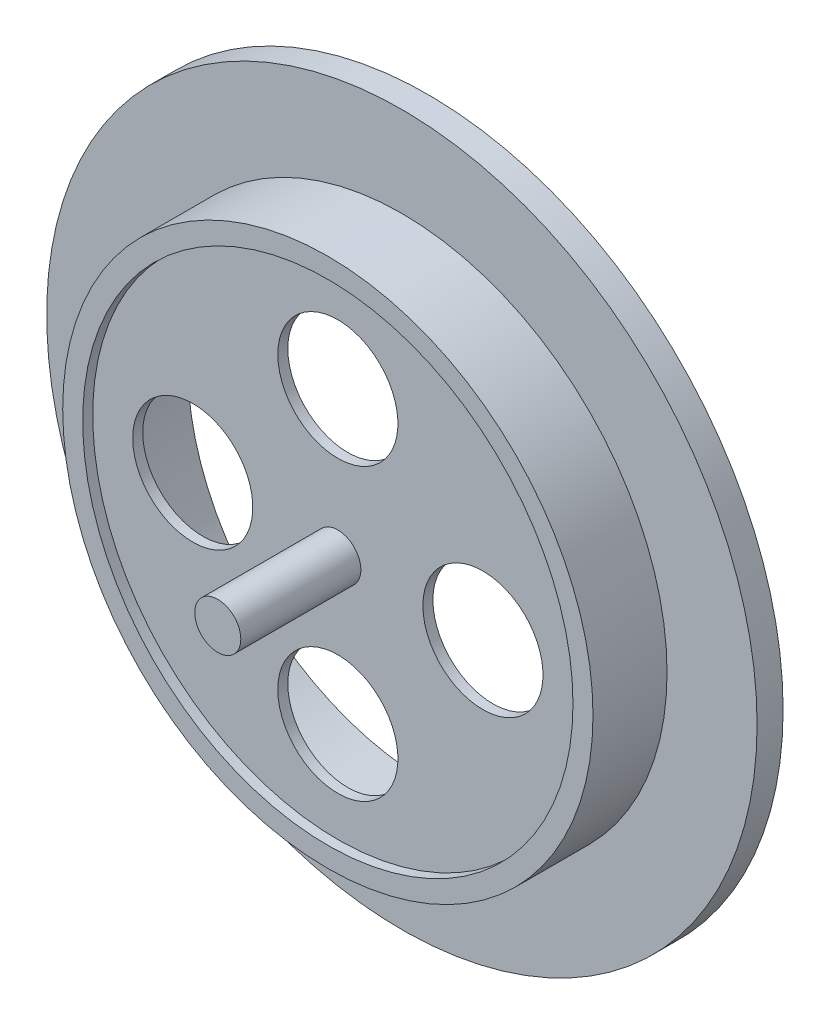
ISO-10303-21;
HEADER;
FILE_DESCRIPTION(('STEP AP214'),'2;1');
FILE_NAME('part.step','',(''),(''),'','','');
FILE_SCHEMA(('AUTOMOTIVE_DESIGN { 1 0 10303 214 1 1 1 1 }'));
ENDSEC;
DATA;
#1=APPLICATION_CONTEXT('core data for automotive mechanical design processes');
#2=APPLICATION_PROTOCOL_DEFINITION('international standard','automotive_design',2000,#1);
#3=PRODUCT_CONTEXT('',#1,'mechanical');
#4=PRODUCT('Part','Part','',(#3));
#5=PRODUCT_RELATED_PRODUCT_CATEGORY('part','',(#4));
#6=PRODUCT_DEFINITION_FORMATION('','',#4);
#7=PRODUCT_DEFINITION_CONTEXT('part definition',#1,'design');
#8=PRODUCT_DEFINITION('design','',#6,#7);
#9=PRODUCT_DEFINITION_SHAPE('','',#8);
#10=(LENGTH_UNIT() NAMED_UNIT(*) SI_UNIT(.MILLI.,.METRE.));
#11=(NAMED_UNIT(*) PLANE_ANGLE_UNIT() SI_UNIT($,.RADIAN.));
#12=(NAMED_UNIT(*) SI_UNIT($,.STERADIAN.) SOLID_ANGLE_UNIT());
#13=UNCERTAINTY_MEASURE_WITH_UNIT(LENGTH_MEASURE(1.E-05),#10,'distance_accuracy_value','');
#14=(GEOMETRIC_REPRESENTATION_CONTEXT(3) GLOBAL_UNCERTAINTY_ASSIGNED_CONTEXT((#13)) GLOBAL_UNIT_ASSIGNED_CONTEXT((#10,
#11,#12)) REPRESENTATION_CONTEXT('',''));
#15=CARTESIAN_POINT('',(0.,0.,0.));
#16=DIRECTION('',(0.,0.,1.));
#17=DIRECTION('',(1.,0.,0.));
#18=AXIS2_PLACEMENT_3D('',#15,#16,#17);
#19=CARTESIAN_POINT('',(0.,0.,1.3));
#20=DIRECTION('',(0.,0.,-1.));
#21=DIRECTION('',(-1.,0.,0.));
#22=AXIS2_PLACEMENT_3D('',#19,#20,#21);
#23=CYLINDRICAL_SURFACE('',#22,17.75);
#24=CARTESIAN_POINT('',(0.,0.,1.3));
#25=DIRECTION('',(0.,0.,1.));
#26=DIRECTION('',(1.,0.,0.));
#27=AXIS2_PLACEMENT_3D('',#24,#25,#26);
#28=CIRCLE('',#27,17.75);
#29=CARTESIAN_POINT('',(17.75,0.,1.3));
#30=VERTEX_POINT('',#29);
#31=EDGE_CURVE('E45',#30,#30,#28,.T.);
#32=ORIENTED_EDGE('',*,*,#31,.F.);
#33=EDGE_LOOP('',(#32));
#34=FACE_BOUND('',#33,.T.);
#35=CARTESIAN_POINT('',(0.,0.,0.));
#36=DIRECTION('',(0.,0.,1.));
#37=DIRECTION('',(1.,0.,0.));
#38=AXIS2_PLACEMENT_3D('',#35,#36,#37);
#39=CIRCLE('',#38,17.75);
#40=CARTESIAN_POINT('',(17.75,0.,0.));
#41=VERTEX_POINT('',#40);
#42=EDGE_CURVE('E40',#41,#41,#39,.T.);
#43=ORIENTED_EDGE('',*,*,#42,.T.);
#44=EDGE_LOOP('',(#43));
#45=FACE_BOUND('',#44,.T.);
#46=ADVANCED_FACE('F37',(#34,#45),#23,.T.);
#47=CARTESIAN_POINT('',(0.,0.,1.3));
#48=DIRECTION('',(0.,0.,1.));
#49=DIRECTION('',(1.,0.,0.));
#50=AXIS2_PLACEMENT_3D('',#47,#48,#49);
#51=PLANE('',#50);
#52=CARTESIAN_POINT('',(0.,0.,1.3));
#53=DIRECTION('',(0.,0.,1.));
#54=DIRECTION('',(1.,0.,0.));
#55=AXIS2_PLACEMENT_3D('',#52,#53,#54);
#56=CIRCLE('',#55,13.25);
#57=CARTESIAN_POINT('',(13.25,0.,1.3));
#58=VERTEX_POINT('',#57);
#59=EDGE_CURVE('E10',#58,#58,#56,.T.);
#60=ORIENTED_EDGE('',*,*,#59,.F.);
#61=EDGE_LOOP('',(#60));
#62=FACE_BOUND('',#61,.T.);
#63=ORIENTED_EDGE('',*,*,#31,.T.);
#64=EDGE_LOOP('',(#63));
#65=FACE_BOUND('',#64,.T.);
#66=ADVANCED_FACE('F158',(#62,#65),#51,.T.);
#67=CARTESIAN_POINT('',(0.,0.,0.));
#68=DIRECTION('',(0.,0.,1.));
#69=DIRECTION('',(1.,0.,0.));
#70=AXIS2_PLACEMENT_3D('',#67,#68,#69);
#71=PLANE('',#70);
#72=CARTESIAN_POINT('',(0.,0.,0.));
#73=DIRECTION('',(0.,0.,-1.));
#74=DIRECTION('',(-1.,0.,0.));
#75=AXIS2_PLACEMENT_3D('',#72,#73,#74);
#76=CIRCLE('',#75,12.);
#77=CARTESIAN_POINT('',(-12.,0.,0.));
#78=VERTEX_POINT('',#77);
#79=EDGE_CURVE('E57',#78,#78,#76,.T.);
#80=ORIENTED_EDGE('',*,*,#79,.F.);
#81=EDGE_LOOP('',(#80));
#82=FACE_BOUND('',#81,.T.);
#83=ORIENTED_EDGE('',*,*,#42,.F.);
#84=EDGE_LOOP('',(#83));
#85=FACE_BOUND('',#84,.T.);
#86=ADVANCED_FACE('F153',(#82,#85),#71,.F.);
#87=CARTESIAN_POINT('',(0.,0.,5.));
#88=DIRECTION('',(0.,0.,-1.));
#89=DIRECTION('',(-1.,0.,0.));
#90=AXIS2_PLACEMENT_3D('',#87,#88,#89);
#91=CYLINDRICAL_SURFACE('',#90,13.25);
#92=CARTESIAN_POINT('',(0.,0.,5.));
#93=DIRECTION('',(0.,0.,1.));
#94=DIRECTION('',(1.,0.,0.));
#95=AXIS2_PLACEMENT_3D('',#92,#93,#94);
#96=CIRCLE('',#95,13.25);
#97=CARTESIAN_POINT('',(13.25,0.,5.));
#98=VERTEX_POINT('',#97);
#99=EDGE_CURVE('E52',#98,#98,#96,.T.);
#100=ORIENTED_EDGE('',*,*,#99,.F.);
#101=EDGE_LOOP('',(#100));
#102=FACE_BOUND('',#101,.T.);
#103=ORIENTED_EDGE('',*,*,#59,.T.);
#104=EDGE_LOOP('',(#103));
#105=FACE_BOUND('',#104,.T.);
#106=ADVANCED_FACE('F148',(#102,#105),#91,.T.);
#107=CARTESIAN_POINT('',(0.,0.,5.));
#108=DIRECTION('',(0.,0.,1.));
#109=DIRECTION('',(1.,0.,0.));
#110=AXIS2_PLACEMENT_3D('',#107,#108,#109);
#111=PLANE('',#110);
#112=CARTESIAN_POINT('',(0.,0.,5.));
#113=DIRECTION('',(0.,0.,1.));
#114=DIRECTION('',(1.,0.,0.));
#115=AXIS2_PLACEMENT_3D('',#112,#113,#114);
#116=CIRCLE('',#115,12.25);
#117=CARTESIAN_POINT('',(12.25,0.,5.));
#118=VERTEX_POINT('',#117);
#119=EDGE_CURVE('E65',#118,#118,#116,.T.);
#120=ORIENTED_EDGE('',*,*,#119,.F.);
#121=EDGE_LOOP('',(#120));
#122=FACE_BOUND('',#121,.T.);
#123=ORIENTED_EDGE('',*,*,#99,.T.);
#124=EDGE_LOOP('',(#123));
#125=FACE_BOUND('',#124,.T.);
#126=ADVANCED_FACE('F144',(#122,#125),#111,.T.);
#127=CARTESIAN_POINT('',(0.,0.,4.));
#128=DIRECTION('',(0.,0.,-1.));
#129=DIRECTION('',(-1.,0.,0.));
#130=AXIS2_PLACEMENT_3D('',#127,#128,#129);
#131=CYLINDRICAL_SURFACE('',#130,12.);
#132=CARTESIAN_POINT('',(0.,0.,4.));
#133=DIRECTION('',(0.,0.,-1.));
#134=DIRECTION('',(-1.,0.,0.));
#135=AXIS2_PLACEMENT_3D('',#132,#133,#134);
#136=CIRCLE('',#135,12.);
#137=CARTESIAN_POINT('',(-12.,0.,4.));
#138=VERTEX_POINT('',#137);
#139=EDGE_CURVE('E56',#138,#138,#136,.T.);
#140=ORIENTED_EDGE('',*,*,#139,.F.);
#141=EDGE_LOOP('',(#140));
#142=FACE_BOUND('',#141,.T.);
#143=ORIENTED_EDGE('',*,*,#79,.T.);
#144=EDGE_LOOP('',(#143));
#145=FACE_BOUND('',#144,.T.);
#146=ADVANCED_FACE('F147',(#142,#145),#131,.F.);
#147=CARTESIAN_POINT('',(0.,0.,4.));
#148=DIRECTION('',(0.,0.,-1.));
#149=DIRECTION('',(-1.,0.,0.));
#150=AXIS2_PLACEMENT_3D('',#147,#148,#149);
#151=PLANE('',#150);
#152=CARTESIAN_POINT('',(0.,7.25,4.));
#153=DIRECTION('',(0.,0.,-1.));
#154=DIRECTION('',(-1.,0.,0.));
#155=AXIS2_PLACEMENT_3D('',#152,#153,#154);
#156=CIRCLE('',#155,3.);
#157=CARTESIAN_POINT('',(-3.,7.25,4.));
#158=VERTEX_POINT('',#157);
#159=EDGE_CURVE('E98',#158,#158,#156,.T.);
#160=ORIENTED_EDGE('',*,*,#159,.F.);
#161=EDGE_LOOP('',(#160));
#162=FACE_BOUND('',#161,.T.);
#163=CARTESIAN_POINT('',(-7.25000000000021,2.05169524441047E-13,4.));
#164=DIRECTION('',(0.,0.,-1.));
#165=DIRECTION('',(-1.,0.,0.));
#166=AXIS2_PLACEMENT_3D('',#163,#164,#165);
#167=CIRCLE('',#166,3.00000000000016);
#168=CARTESIAN_POINT('',(-10.2500000000004,2.05169524441047E-13,4.));
#169=VERTEX_POINT('',#168);
#170=EDGE_CURVE('E90',#169,#169,#167,.T.);
#171=ORIENTED_EDGE('',*,*,#170,.F.);
#172=EDGE_LOOP('',(#171));
#173=FACE_BOUND('',#172,.T.);
#174=CARTESIAN_POINT('',(-4.10339048882094E-13,-7.25,4.));
#175=DIRECTION('',(0.,0.,-1.));
#176=DIRECTION('',(-1.,0.,0.));
#177=AXIS2_PLACEMENT_3D('',#174,#175,#176);
#178=CIRCLE('',#177,3.00000000000044);
#179=CARTESIAN_POINT('',(-3.00000000000085,-7.25,4.));
#180=VERTEX_POINT('',#179);
#181=EDGE_CURVE('E82',#180,#180,#178,.T.);
#182=ORIENTED_EDGE('',*,*,#181,.F.);
#183=EDGE_LOOP('',(#182));
#184=FACE_BOUND('',#183,.T.);
#185=CARTESIAN_POINT('',(7.2499999999998,-2.06057393370429E-13,4.));
#186=DIRECTION('',(0.,0.,-1.));
#187=DIRECTION('',(-1.,0.,0.));
#188=AXIS2_PLACEMENT_3D('',#185,#186,#187);
#189=CIRCLE('',#188,3.00000000000033);
#190=CARTESIAN_POINT('',(4.24999999999947,-2.06057393370429E-13,4.));
#191=VERTEX_POINT('',#190);
#192=EDGE_CURVE('E73',#191,#191,#189,.T.);
#193=ORIENTED_EDGE('',*,*,#192,.F.);
#194=EDGE_LOOP('',(#193));
#195=FACE_BOUND('',#194,.T.);
#196=ORIENTED_EDGE('',*,*,#139,.T.);
#197=EDGE_LOOP('',(#196));
#198=FACE_BOUND('',#197,.T.);
#199=ADVANCED_FACE('F140',(#162,#173,#184,#195,#198),#151,.T.);
#200=CARTESIAN_POINT('',(0.,0.,4.5));
#201=DIRECTION('',(0.,0.,1.));
#202=DIRECTION('',(1.,0.,0.));
#203=AXIS2_PLACEMENT_3D('',#200,#201,#202);
#204=CYLINDRICAL_SURFACE('',#203,12.25);
#205=CARTESIAN_POINT('',(0.,0.,4.5));
#206=DIRECTION('',(0.,0.,1.));
#207=DIRECTION('',(1.,0.,0.));
#208=AXIS2_PLACEMENT_3D('',#205,#206,#207);
#209=CIRCLE('',#208,12.25);
#210=CARTESIAN_POINT('',(12.25,0.,4.5));
#211=VERTEX_POINT('',#210);
#212=EDGE_CURVE('E61',#211,#211,#209,.T.);
#213=ORIENTED_EDGE('',*,*,#212,.F.);
#214=EDGE_LOOP('',(#213));
#215=FACE_BOUND('',#214,.T.);
#216=ORIENTED_EDGE('',*,*,#119,.T.);
#217=EDGE_LOOP('',(#216));
#218=FACE_BOUND('',#217,.T.);
#219=ADVANCED_FACE('F126',(#215,#218),#204,.F.);
#220=CARTESIAN_POINT('',(0.,0.,4.5));
#221=DIRECTION('',(0.,0.,1.));
#222=DIRECTION('',(1.,0.,0.));
#223=AXIS2_PLACEMENT_3D('',#220,#221,#222);
#224=PLANE('',#223);
#225=CARTESIAN_POINT('',(0.,0.,4.5));
#226=DIRECTION('',(0.,0.,1.));
#227=DIRECTION('',(1.,0.,0.));
#228=AXIS2_PLACEMENT_3D('',#225,#226,#227);
#229=CIRCLE('',#228,1.15);
#230=CARTESIAN_POINT('',(1.15,0.,4.5));
#231=VERTEX_POINT('',#230);
#232=EDGE_CURVE('E105',#231,#231,#229,.T.);
#233=ORIENTED_EDGE('',*,*,#232,.F.);
#234=EDGE_LOOP('',(#233));
#235=FACE_BOUND('',#234,.T.);
#236=CARTESIAN_POINT('',(0.,7.25,4.5));
#237=DIRECTION('',(0.,0.,-1.));
#238=DIRECTION('',(-1.,0.,0.));
#239=AXIS2_PLACEMENT_3D('',#236,#237,#238);
#240=CIRCLE('',#239,3.);
#241=CARTESIAN_POINT('',(-3.,7.25,4.5));
#242=VERTEX_POINT('',#241);
#243=EDGE_CURVE('E69',#242,#242,#240,.T.);
#244=ORIENTED_EDGE('',*,*,#243,.T.);
#245=EDGE_LOOP('',(#244));
#246=FACE_BOUND('',#245,.T.);
#247=CARTESIAN_POINT('',(-7.25000000000021,2.05169524441047E-13,4.5));
#248=DIRECTION('',(0.,0.,-1.));
#249=DIRECTION('',(-1.,0.,0.));
#250=AXIS2_PLACEMENT_3D('',#247,#248,#249);
#251=CIRCLE('',#250,3.00000000000016);
#252=CARTESIAN_POINT('',(-10.2500000000004,2.05169524441047E-13,4.5));
#253=VERTEX_POINT('',#252);
#254=EDGE_CURVE('E94',#253,#253,#251,.T.);
#255=ORIENTED_EDGE('',*,*,#254,.T.);
#256=EDGE_LOOP('',(#255));
#257=FACE_BOUND('',#256,.T.);
#258=CARTESIAN_POINT('',(-4.10339048882094E-13,-7.25,4.5));
#259=DIRECTION('',(0.,0.,-1.));
#260=DIRECTION('',(-1.,0.,0.));
#261=AXIS2_PLACEMENT_3D('',#258,#259,#260);
#262=CIRCLE('',#261,3.00000000000044);
#263=CARTESIAN_POINT('',(-3.00000000000085,-7.25,4.5));
#264=VERTEX_POINT('',#263);
#265=EDGE_CURVE('E86',#264,#264,#262,.T.);
#266=ORIENTED_EDGE('',*,*,#265,.T.);
#267=EDGE_LOOP('',(#266));
#268=FACE_BOUND('',#267,.T.);
#269=CARTESIAN_POINT('',(7.2499999999998,-2.06057393370429E-13,4.5));
#270=DIRECTION('',(0.,0.,-1.));
#271=DIRECTION('',(-1.,0.,0.));
#272=AXIS2_PLACEMENT_3D('',#269,#270,#271);
#273=CIRCLE('',#272,3.00000000000033);
#274=CARTESIAN_POINT('',(4.24999999999947,-2.06057393370429E-13,4.5));
#275=VERTEX_POINT('',#274);
#276=EDGE_CURVE('E77',#275,#275,#273,.T.);
#277=ORIENTED_EDGE('',*,*,#276,.T.);
#278=EDGE_LOOP('',(#277));
#279=FACE_BOUND('',#278,.T.);
#280=ORIENTED_EDGE('',*,*,#212,.T.);
#281=EDGE_LOOP('',(#280));
#282=FACE_BOUND('',#281,.T.);
#283=ADVANCED_FACE('F122',(#235,#246,#257,#268,#279,#282),#224,.T.);
#284=CARTESIAN_POINT('',(7.2499999999998,-2.06057393370429E-13,4.5));
#285=DIRECTION('',(0.,0.,-1.));
#286=DIRECTION('',(-1.,0.,0.));
#287=AXIS2_PLACEMENT_3D('',#284,#285,#286);
#288=CYLINDRICAL_SURFACE('',#287,3.00000000000033);
#289=ORIENTED_EDGE('',*,*,#276,.F.);
#290=EDGE_LOOP('',(#289));
#291=FACE_BOUND('',#290,.T.);
#292=ORIENTED_EDGE('',*,*,#192,.T.);
#293=EDGE_LOOP('',(#292));
#294=FACE_BOUND('',#293,.T.);
#295=ADVANCED_FACE('F125',(#291,#294),#288,.F.);
#296=CARTESIAN_POINT('',(-4.10339048882094E-13,-7.25,4.5));
#297=DIRECTION('',(0.,0.,-1.));
#298=DIRECTION('',(-1.,0.,0.));
#299=AXIS2_PLACEMENT_3D('',#296,#297,#298);
#300=CYLINDRICAL_SURFACE('',#299,3.00000000000044);
#301=ORIENTED_EDGE('',*,*,#265,.F.);
#302=EDGE_LOOP('',(#301));
#303=FACE_BOUND('',#302,.T.);
#304=ORIENTED_EDGE('',*,*,#181,.T.);
#305=EDGE_LOOP('',(#304));
#306=FACE_BOUND('',#305,.T.);
#307=ADVANCED_FACE('F222',(#303,#306),#300,.F.);
#308=CARTESIAN_POINT('',(-7.25000000000021,2.05169524441047E-13,4.5));
#309=DIRECTION('',(0.,0.,-1.));
#310=DIRECTION('',(-1.,0.,0.));
#311=AXIS2_PLACEMENT_3D('',#308,#309,#310);
#312=CYLINDRICAL_SURFACE('',#311,3.00000000000016);
#313=ORIENTED_EDGE('',*,*,#254,.F.);
#314=EDGE_LOOP('',(#313));
#315=FACE_BOUND('',#314,.T.);
#316=ORIENTED_EDGE('',*,*,#170,.T.);
#317=EDGE_LOOP('',(#316));
#318=FACE_BOUND('',#317,.T.);
#319=ADVANCED_FACE('F232',(#315,#318),#312,.F.);
#320=CARTESIAN_POINT('',(0.,7.25,4.5));
#321=DIRECTION('',(0.,0.,-1.));
#322=DIRECTION('',(-1.,0.,0.));
#323=AXIS2_PLACEMENT_3D('',#320,#321,#322);
#324=CYLINDRICAL_SURFACE('',#323,3.);
#325=ORIENTED_EDGE('',*,*,#243,.F.);
#326=EDGE_LOOP('',(#325));
#327=FACE_BOUND('',#326,.T.);
#328=ORIENTED_EDGE('',*,*,#159,.T.);
#329=EDGE_LOOP('',(#328));
#330=FACE_BOUND('',#329,.T.);
#331=ADVANCED_FACE('F118',(#327,#330),#324,.F.);
#332=CARTESIAN_POINT('',(0.,0.,10.5));
#333=DIRECTION('',(0.,0.,-1.));
#334=DIRECTION('',(-1.,0.,0.));
#335=AXIS2_PLACEMENT_3D('',#332,#333,#334);
#336=CYLINDRICAL_SURFACE('',#335,1.15);
#337=CARTESIAN_POINT('',(0.,0.,10.5));
#338=DIRECTION('',(0.,0.,1.));
#339=DIRECTION('',(1.,0.,0.));
#340=AXIS2_PLACEMENT_3D('',#337,#338,#339);
#341=CIRCLE('',#340,1.15);
#342=CARTESIAN_POINT('',(1.15,0.,10.5));
#343=VERTEX_POINT('',#342);
#344=EDGE_CURVE('E78',#343,#343,#341,.T.);
#345=ORIENTED_EDGE('',*,*,#344,.F.);
#346=EDGE_LOOP('',(#345));
#347=FACE_BOUND('',#346,.T.);
#348=ORIENTED_EDGE('',*,*,#232,.T.);
#349=EDGE_LOOP('',(#348));
#350=FACE_BOUND('',#349,.T.);
#351=ADVANCED_FACE('F115',(#347,#350),#336,.T.);
#352=CARTESIAN_POINT('',(0.,0.,10.5));
#353=DIRECTION('',(0.,0.,1.));
#354=DIRECTION('',(1.,0.,0.));
#355=AXIS2_PLACEMENT_3D('',#352,#353,#354);
#356=PLANE('',#355);
#357=ORIENTED_EDGE('',*,*,#344,.T.);
#358=EDGE_LOOP('',(#357));
#359=FACE_BOUND('',#358,.T.);
#360=ADVANCED_FACE('F113',(#359),#356,.T.);
#361=CLOSED_SHELL('',(#46,#66,#86,#106,#126,#146,#199,#219,#283,#295,#307,#319,#331,#351,#360));
#362=MANIFOLD_SOLID_BREP('B2',#361);
#363=ADVANCED_BREP_SHAPE_REPRESENTATION('',(#18,#362),#14);
#364=SHAPE_DEFINITION_REPRESENTATION(#9,#363);
ENDSEC;
END-ISO-10303-21;
